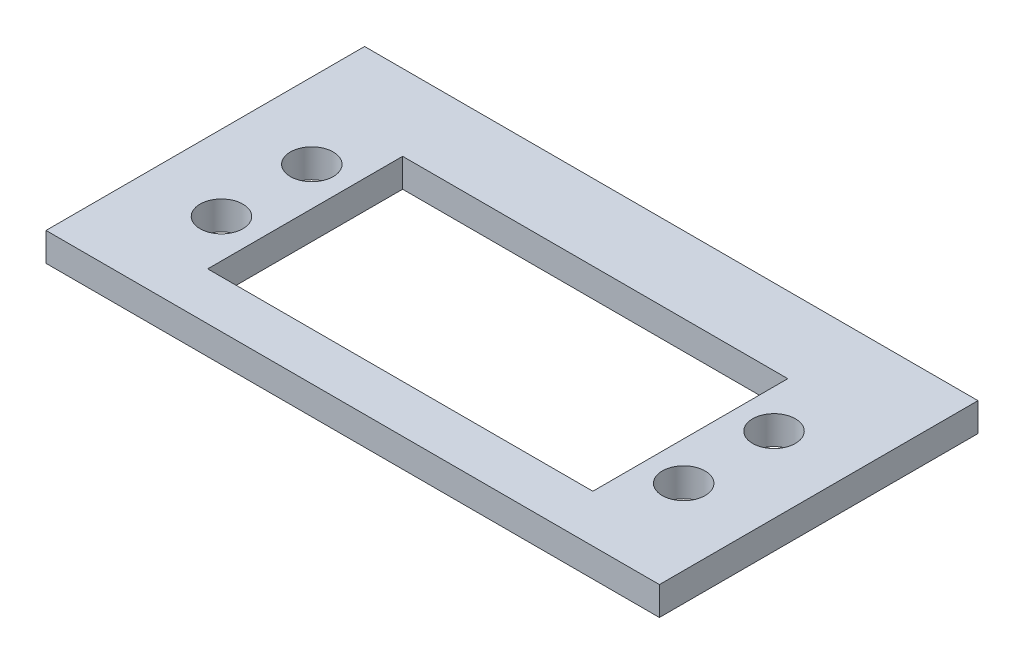
ISO-10303-21;
HEADER;
FILE_DESCRIPTION(('STEP AP214'),'2;1');
FILE_NAME('part.step','',(''),(''),'','','');
FILE_SCHEMA(('AUTOMOTIVE_DESIGN { 1 0 10303 214 1 1 1 1 }'));
ENDSEC;
DATA;
#1=APPLICATION_CONTEXT('core data for automotive mechanical design processes');
#2=APPLICATION_PROTOCOL_DEFINITION('international standard','automotive_design',2000,#1);
#3=PRODUCT_CONTEXT('',#1,'mechanical');
#4=PRODUCT('Part','Part','',(#3));
#5=PRODUCT_RELATED_PRODUCT_CATEGORY('part','',(#4));
#6=PRODUCT_DEFINITION_FORMATION('','',#4);
#7=PRODUCT_DEFINITION_CONTEXT('part definition',#1,'design');
#8=PRODUCT_DEFINITION('design','',#6,#7);
#9=PRODUCT_DEFINITION_SHAPE('','',#8);
#10=(LENGTH_UNIT() NAMED_UNIT(*) SI_UNIT(.MILLI.,.METRE.));
#11=(NAMED_UNIT(*) PLANE_ANGLE_UNIT() SI_UNIT($,.RADIAN.));
#12=(NAMED_UNIT(*) SI_UNIT($,.STERADIAN.) SOLID_ANGLE_UNIT());
#13=UNCERTAINTY_MEASURE_WITH_UNIT(LENGTH_MEASURE(1.E-05),#10,'distance_accuracy_value','');
#14=(GEOMETRIC_REPRESENTATION_CONTEXT(3) GLOBAL_UNCERTAINTY_ASSIGNED_CONTEXT((#13)) GLOBAL_UNIT_ASSIGNED_CONTEXT((#10,
#11,#12)) REPRESENTATION_CONTEXT('',''));
#15=CARTESIAN_POINT('',(0.,0.,0.));
#16=DIRECTION('',(0.,0.,1.));
#17=DIRECTION('',(1.,0.,0.));
#18=AXIS2_PLACEMENT_3D('',#15,#16,#17);
#19=CARTESIAN_POINT('',(0.,3.,0.));
#20=DIRECTION('',(0.,-1.,0.));
#21=DIRECTION('',(0.,0.,-1.));
#22=AXIS2_PLACEMENT_3D('',#19,#20,#21);
#23=PLANE('',#22);
#24=CARTESIAN_POINT('',(56.55,3.,-20.));
#25=DIRECTION('',(0.,1.,0.));
#26=DIRECTION('',(0.,0.,1.));
#27=AXIS2_PLACEMENT_3D('',#24,#25,#26);
#28=CIRCLE('',#27,2.25);
#29=CARTESIAN_POINT('',(56.55,3.,-17.75));
#30=VERTEX_POINT('',#29);
#31=EDGE_CURVE('E250',#30,#30,#28,.T.);
#32=ORIENTED_EDGE('',*,*,#31,.F.);
#33=EDGE_LOOP('',(#32));
#34=FACE_BOUND('',#33,.T.);
#35=CARTESIAN_POINT('',(7.95,3.,-20.));
#36=DIRECTION('',(0.,1.,0.));
#37=DIRECTION('',(0.,0.,1.));
#38=AXIS2_PLACEMENT_3D('',#35,#36,#37);
#39=CIRCLE('',#38,2.25);
#40=CARTESIAN_POINT('',(7.95,3.,-17.75));
#41=VERTEX_POINT('',#40);
#42=EDGE_CURVE('E131',#41,#41,#39,.T.);
#43=ORIENTED_EDGE('',*,*,#42,.F.);
#44=EDGE_LOOP('',(#43));
#45=FACE_BOUND('',#44,.T.);
#46=DIRECTION('',(0.,0.,1.));
#47=VECTOR('',#46,1.);
#48=CARTESIAN_POINT('',(0.,3.,0.));
#49=LINE('',#48,#47);
#50=CARTESIAN_POINT('',(0.,3.,-33.5));
#51=VERTEX_POINT('',#50);
#52=CARTESIAN_POINT('',(0.,3.,0.));
#53=VERTEX_POINT('',#52);
#54=EDGE_CURVE('E141',#51,#53,#49,.T.);
#55=ORIENTED_EDGE('',*,*,#54,.T.);
#56=DIRECTION('',(1.,0.,0.));
#57=VECTOR('',#56,1.);
#58=CARTESIAN_POINT('',(0.,3.,0.));
#59=LINE('',#58,#57);
#60=CARTESIAN_POINT('',(64.5,3.,0.));
#61=VERTEX_POINT('',#60);
#62=EDGE_CURVE('E144',#53,#61,#59,.T.);
#63=ORIENTED_EDGE('',*,*,#62,.T.);
#64=DIRECTION('',(0.,0.,-1.));
#65=VECTOR('',#64,1.);
#66=CARTESIAN_POINT('',(64.5,3.,0.));
#67=LINE('',#66,#65);
#68=CARTESIAN_POINT('',(64.5,3.,-33.5));
#69=VERTEX_POINT('',#68);
#70=EDGE_CURVE('E147',#61,#69,#67,.T.);
#71=ORIENTED_EDGE('',*,*,#70,.T.);
#72=DIRECTION('',(-1.,0.,0.));
#73=VECTOR('',#72,1.);
#74=CARTESIAN_POINT('',(0.,3.,-33.5));
#75=LINE('',#74,#73);
#76=EDGE_CURVE('E149',#69,#51,#75,.T.);
#77=ORIENTED_EDGE('',*,*,#76,.T.);
#78=EDGE_LOOP('',(#55,#63,#71,#77));
#79=FACE_BOUND('',#78,.T.);
#80=DIRECTION('',(0.,0.,1.));
#81=VECTOR('',#80,1.);
#82=CARTESIAN_POINT('',(12.,3.,-4.99999999999999));
#83=LINE('',#82,#81);
#84=CARTESIAN_POINT('',(12.,3.,-25.5));
#85=VERTEX_POINT('',#84);
#86=CARTESIAN_POINT('',(12.,3.,-4.99999999999999));
#87=VERTEX_POINT('',#86);
#88=EDGE_CURVE('E102',#85,#87,#83,.T.);
#89=ORIENTED_EDGE('',*,*,#88,.F.);
#90=DIRECTION('',(-1.,0.,0.));
#91=VECTOR('',#90,1.);
#92=CARTESIAN_POINT('',(12.,3.,-25.5));
#93=LINE('',#92,#91);
#94=CARTESIAN_POINT('',(52.5,3.,-25.5));
#95=VERTEX_POINT('',#94);
#96=EDGE_CURVE('E125',#95,#85,#93,.T.);
#97=ORIENTED_EDGE('',*,*,#96,.F.);
#98=DIRECTION('',(0.,0.,-1.));
#99=VECTOR('',#98,1.);
#100=CARTESIAN_POINT('',(52.5,3.,-4.99999999999999));
#101=LINE('',#100,#99);
#102=CARTESIAN_POINT('',(52.5,3.,-4.99999999999999));
#103=VERTEX_POINT('',#102);
#104=EDGE_CURVE('E123',#103,#95,#101,.T.);
#105=ORIENTED_EDGE('',*,*,#104,.F.);
#106=DIRECTION('',(1.,0.,0.));
#107=VECTOR('',#106,1.);
#108=CARTESIAN_POINT('',(12.,3.,-4.99999999999999));
#109=LINE('',#108,#107);
#110=EDGE_CURVE('E110',#87,#103,#109,.T.);
#111=ORIENTED_EDGE('',*,*,#110,.F.);
#112=EDGE_LOOP('',(#89,#97,#105,#111));
#113=FACE_BOUND('',#112,.T.);
#114=CARTESIAN_POINT('',(7.95,3.,-10.5));
#115=DIRECTION('',(0.,1.,0.));
#116=DIRECTION('',(0.,0.,1.));
#117=AXIS2_PLACEMENT_3D('',#114,#115,#116);
#118=CIRCLE('',#117,2.25);
#119=CARTESIAN_POINT('',(7.95,3.,-8.25));
#120=VERTEX_POINT('',#119);
#121=EDGE_CURVE('E256',#120,#120,#118,.T.);
#122=ORIENTED_EDGE('',*,*,#121,.F.);
#123=EDGE_LOOP('',(#122));
#124=FACE_BOUND('',#123,.T.);
#125=CARTESIAN_POINT('',(56.55,3.,-10.5));
#126=DIRECTION('',(0.,1.,0.));
#127=DIRECTION('',(0.,0.,1.));
#128=AXIS2_PLACEMENT_3D('',#125,#126,#127);
#129=CIRCLE('',#128,2.25);
#130=CARTESIAN_POINT('',(56.55,3.,-8.24999999999999));
#131=VERTEX_POINT('',#130);
#132=EDGE_CURVE('E241',#131,#131,#129,.T.);
#133=ORIENTED_EDGE('',*,*,#132,.F.);
#134=EDGE_LOOP('',(#133));
#135=FACE_BOUND('',#134,.T.);
#136=ADVANCED_FACE('F37',(#34,#45,#79,#113,#124,#135),#23,.F.);
#137=CARTESIAN_POINT('',(0.,0.,0.));
#138=DIRECTION('',(0.,-1.,0.));
#139=DIRECTION('',(0.,0.,-1.));
#140=AXIS2_PLACEMENT_3D('',#137,#138,#139);
#141=PLANE('',#140);
#142=CARTESIAN_POINT('',(56.55,0.,-20.));
#143=DIRECTION('',(0.,1.,0.));
#144=DIRECTION('',(0.,0.,1.));
#145=AXIS2_PLACEMENT_3D('',#142,#143,#144);
#146=CIRCLE('',#145,2.25);
#147=CARTESIAN_POINT('',(56.55,0.,-17.75));
#148=VERTEX_POINT('',#147);
#149=EDGE_CURVE('E247',#148,#148,#146,.T.);
#150=ORIENTED_EDGE('',*,*,#149,.T.);
#151=EDGE_LOOP('',(#150));
#152=FACE_BOUND('',#151,.T.);
#153=CARTESIAN_POINT('',(7.95,0.,-20.));
#154=DIRECTION('',(0.,1.,0.));
#155=DIRECTION('',(0.,0.,1.));
#156=AXIS2_PLACEMENT_3D('',#153,#154,#155);
#157=CIRCLE('',#156,2.25);
#158=CARTESIAN_POINT('',(7.95,0.,-17.75));
#159=VERTEX_POINT('',#158);
#160=EDGE_CURVE('E259',#159,#159,#157,.T.);
#161=ORIENTED_EDGE('',*,*,#160,.T.);
#162=EDGE_LOOP('',(#161));
#163=FACE_BOUND('',#162,.T.);
#164=DIRECTION('',(0.,0.,1.));
#165=VECTOR('',#164,1.);
#166=CARTESIAN_POINT('',(0.,0.,0.));
#167=LINE('',#166,#165);
#168=CARTESIAN_POINT('',(0.,0.,-33.5));
#169=VERTEX_POINT('',#168);
#170=CARTESIAN_POINT('',(0.,0.,0.));
#171=VERTEX_POINT('',#170);
#172=EDGE_CURVE('E118',#169,#171,#167,.T.);
#173=ORIENTED_EDGE('',*,*,#172,.F.);
#174=DIRECTION('',(-1.,0.,0.));
#175=VECTOR('',#174,1.);
#176=CARTESIAN_POINT('',(0.,0.,-33.5));
#177=LINE('',#176,#175);
#178=CARTESIAN_POINT('',(64.5,0.,-33.5));
#179=VERTEX_POINT('',#178);
#180=EDGE_CURVE('E145',#179,#169,#177,.T.);
#181=ORIENTED_EDGE('',*,*,#180,.F.);
#182=DIRECTION('',(0.,0.,-1.));
#183=VECTOR('',#182,1.);
#184=CARTESIAN_POINT('',(64.5,0.,0.));
#185=LINE('',#184,#183);
#186=CARTESIAN_POINT('',(64.5,0.,0.));
#187=VERTEX_POINT('',#186);
#188=EDGE_CURVE('E156',#187,#179,#185,.T.);
#189=ORIENTED_EDGE('',*,*,#188,.F.);
#190=DIRECTION('',(1.,0.,0.));
#191=VECTOR('',#190,1.);
#192=CARTESIAN_POINT('',(0.,0.,0.));
#193=LINE('',#192,#191);
#194=EDGE_CURVE('E154',#171,#187,#193,.T.);
#195=ORIENTED_EDGE('',*,*,#194,.F.);
#196=EDGE_LOOP('',(#173,#181,#189,#195));
#197=FACE_BOUND('',#196,.T.);
#198=DIRECTION('',(-1.,0.,0.));
#199=VECTOR('',#198,1.);
#200=CARTESIAN_POINT('',(12.,0.,-25.5));
#201=LINE('',#200,#199);
#202=CARTESIAN_POINT('',(52.5,0.,-25.5));
#203=VERTEX_POINT('',#202);
#204=CARTESIAN_POINT('',(12.,0.,-25.5));
#205=VERTEX_POINT('',#204);
#206=EDGE_CURVE('E111',#203,#205,#201,.T.);
#207=ORIENTED_EDGE('',*,*,#206,.T.);
#208=DIRECTION('',(0.,0.,1.));
#209=VECTOR('',#208,1.);
#210=CARTESIAN_POINT('',(12.,0.,-4.99999999999999));
#211=LINE('',#210,#209);
#212=CARTESIAN_POINT('',(12.,0.,-4.99999999999999));
#213=VERTEX_POINT('',#212);
#214=EDGE_CURVE('E60',#205,#213,#211,.T.);
#215=ORIENTED_EDGE('',*,*,#214,.T.);
#216=DIRECTION('',(1.,0.,0.));
#217=VECTOR('',#216,1.);
#218=CARTESIAN_POINT('',(12.,0.,-4.99999999999999));
#219=LINE('',#218,#217);
#220=CARTESIAN_POINT('',(52.5,0.,-4.99999999999999));
#221=VERTEX_POINT('',#220);
#222=EDGE_CURVE('E117',#213,#221,#219,.T.);
#223=ORIENTED_EDGE('',*,*,#222,.T.);
#224=DIRECTION('',(0.,0.,-1.));
#225=VECTOR('',#224,1.);
#226=CARTESIAN_POINT('',(52.5,0.,-4.99999999999999));
#227=LINE('',#226,#225);
#228=EDGE_CURVE('E133',#221,#203,#227,.T.);
#229=ORIENTED_EDGE('',*,*,#228,.T.);
#230=EDGE_LOOP('',(#207,#215,#223,#229));
#231=FACE_BOUND('',#230,.T.);
#232=CARTESIAN_POINT('',(7.95,0.,-10.5));
#233=DIRECTION('',(0.,1.,0.));
#234=DIRECTION('',(0.,0.,1.));
#235=AXIS2_PLACEMENT_3D('',#232,#233,#234);
#236=CIRCLE('',#235,2.25);
#237=CARTESIAN_POINT('',(7.95,0.,-8.25));
#238=VERTEX_POINT('',#237);
#239=EDGE_CURVE('E253',#238,#238,#236,.T.);
#240=ORIENTED_EDGE('',*,*,#239,.T.);
#241=EDGE_LOOP('',(#240));
#242=FACE_BOUND('',#241,.T.);
#243=CARTESIAN_POINT('',(56.55,0.,-10.5));
#244=DIRECTION('',(0.,1.,0.));
#245=DIRECTION('',(0.,0.,1.));
#246=AXIS2_PLACEMENT_3D('',#243,#244,#245);
#247=CIRCLE('',#246,2.25);
#248=CARTESIAN_POINT('',(56.55,0.,-8.24999999999999));
#249=VERTEX_POINT('',#248);
#250=EDGE_CURVE('E244',#249,#249,#247,.T.);
#251=ORIENTED_EDGE('',*,*,#250,.T.);
#252=EDGE_LOOP('',(#251));
#253=FACE_BOUND('',#252,.T.);
#254=ADVANCED_FACE('F174',(#152,#163,#197,#231,#242,#253),#141,.T.);
#255=CARTESIAN_POINT('',(0.,3.,0.));
#256=DIRECTION('',(1.,0.,0.));
#257=DIRECTION('',(0.,0.,-1.));
#258=AXIS2_PLACEMENT_3D('',#255,#256,#257);
#259=PLANE('',#258);
#260=ORIENTED_EDGE('',*,*,#172,.T.);
#261=DIRECTION('',(0.,-1.,0.));
#262=VECTOR('',#261,1.);
#263=CARTESIAN_POINT('',(0.,3.,0.));
#264=LINE('',#263,#262);
#265=EDGE_CURVE('E11',#53,#171,#264,.T.);
#266=ORIENTED_EDGE('',*,*,#265,.F.);
#267=ORIENTED_EDGE('',*,*,#54,.F.);
#268=DIRECTION('',(0.,-1.,0.));
#269=VECTOR('',#268,1.);
#270=CARTESIAN_POINT('',(0.,3.,-33.5));
#271=LINE('',#270,#269);
#272=EDGE_CURVE('E151',#51,#169,#271,.T.);
#273=ORIENTED_EDGE('',*,*,#272,.T.);
#274=EDGE_LOOP('',(#260,#266,#267,#273));
#275=FACE_BOUND('',#274,.T.);
#276=ADVANCED_FACE('F39',(#275),#259,.F.);
#277=CARTESIAN_POINT('',(0.,3.,0.));
#278=DIRECTION('',(0.,0.,-1.));
#279=DIRECTION('',(-1.,0.,0.));
#280=AXIS2_PLACEMENT_3D('',#277,#278,#279);
#281=PLANE('',#280);
#282=ORIENTED_EDGE('',*,*,#194,.T.);
#283=DIRECTION('',(0.,-1.,0.));
#284=VECTOR('',#283,1.);
#285=CARTESIAN_POINT('',(64.5,3.,0.));
#286=LINE('',#285,#284);
#287=EDGE_CURVE('E45',#61,#187,#286,.T.);
#288=ORIENTED_EDGE('',*,*,#287,.F.);
#289=ORIENTED_EDGE('',*,*,#62,.F.);
#290=ORIENTED_EDGE('',*,*,#265,.T.);
#291=EDGE_LOOP('',(#282,#288,#289,#290));
#292=FACE_BOUND('',#291,.T.);
#293=ADVANCED_FACE('F184',(#292),#281,.F.);
#294=CARTESIAN_POINT('',(64.5,3.,0.));
#295=DIRECTION('',(-1.,0.,0.));
#296=DIRECTION('',(0.,0.,1.));
#297=AXIS2_PLACEMENT_3D('',#294,#295,#296);
#298=PLANE('',#297);
#299=ORIENTED_EDGE('',*,*,#188,.T.);
#300=DIRECTION('',(0.,-1.,0.));
#301=VECTOR('',#300,1.);
#302=CARTESIAN_POINT('',(64.5,3.,-33.5));
#303=LINE('',#302,#301);
#304=EDGE_CURVE('E161',#69,#179,#303,.T.);
#305=ORIENTED_EDGE('',*,*,#304,.F.);
#306=ORIENTED_EDGE('',*,*,#70,.F.);
#307=ORIENTED_EDGE('',*,*,#287,.T.);
#308=EDGE_LOOP('',(#299,#305,#306,#307));
#309=FACE_BOUND('',#308,.T.);
#310=ADVANCED_FACE('F168',(#309),#298,.F.);
#311=CARTESIAN_POINT('',(0.,3.,-33.5));
#312=DIRECTION('',(0.,0.,1.));
#313=DIRECTION('',(1.,0.,0.));
#314=AXIS2_PLACEMENT_3D('',#311,#312,#313);
#315=PLANE('',#314);
#316=ORIENTED_EDGE('',*,*,#180,.T.);
#317=ORIENTED_EDGE('',*,*,#272,.F.);
#318=ORIENTED_EDGE('',*,*,#76,.F.);
#319=ORIENTED_EDGE('',*,*,#304,.T.);
#320=EDGE_LOOP('',(#316,#317,#318,#319));
#321=FACE_BOUND('',#320,.T.);
#322=ADVANCED_FACE('F178',(#321),#315,.F.);
#323=CARTESIAN_POINT('',(12.,3.,-4.99999999999999));
#324=DIRECTION('',(1.,0.,0.));
#325=DIRECTION('',(0.,0.,-1.));
#326=AXIS2_PLACEMENT_3D('',#323,#324,#325);
#327=PLANE('',#326);
#328=ORIENTED_EDGE('',*,*,#214,.F.);
#329=DIRECTION('',(0.,-1.,0.));
#330=VECTOR('',#329,1.);
#331=CARTESIAN_POINT('',(12.,3.,-25.5));
#332=LINE('',#331,#330);
#333=EDGE_CURVE('E106',#85,#205,#332,.T.);
#334=ORIENTED_EDGE('',*,*,#333,.F.);
#335=ORIENTED_EDGE('',*,*,#88,.T.);
#336=DIRECTION('',(0.,-1.,0.));
#337=VECTOR('',#336,1.);
#338=CARTESIAN_POINT('',(12.,3.,-4.99999999999999));
#339=LINE('',#338,#337);
#340=EDGE_CURVE('E105',#87,#213,#339,.T.);
#341=ORIENTED_EDGE('',*,*,#340,.T.);
#342=EDGE_LOOP('',(#328,#334,#335,#341));
#343=FACE_BOUND('',#342,.T.);
#344=ADVANCED_FACE('F104',(#343),#327,.T.);
#345=CARTESIAN_POINT('',(12.,3.,-4.99999999999999));
#346=DIRECTION('',(0.,0.,-1.));
#347=DIRECTION('',(-1.,0.,0.));
#348=AXIS2_PLACEMENT_3D('',#345,#346,#347);
#349=PLANE('',#348);
#350=ORIENTED_EDGE('',*,*,#222,.F.);
#351=ORIENTED_EDGE('',*,*,#340,.F.);
#352=ORIENTED_EDGE('',*,*,#110,.T.);
#353=DIRECTION('',(0.,-1.,0.));
#354=VECTOR('',#353,1.);
#355=CARTESIAN_POINT('',(52.5,3.,-4.99999999999999));
#356=LINE('',#355,#354);
#357=EDGE_CURVE('E119',#103,#221,#356,.T.);
#358=ORIENTED_EDGE('',*,*,#357,.T.);
#359=EDGE_LOOP('',(#350,#351,#352,#358));
#360=FACE_BOUND('',#359,.T.);
#361=ADVANCED_FACE('F114',(#360),#349,.T.);
#362=CARTESIAN_POINT('',(52.5,3.,-4.99999999999999));
#363=DIRECTION('',(-1.,0.,0.));
#364=DIRECTION('',(0.,0.,1.));
#365=AXIS2_PLACEMENT_3D('',#362,#363,#364);
#366=PLANE('',#365);
#367=ORIENTED_EDGE('',*,*,#228,.F.);
#368=ORIENTED_EDGE('',*,*,#357,.F.);
#369=ORIENTED_EDGE('',*,*,#104,.T.);
#370=DIRECTION('',(0.,-1.,0.));
#371=VECTOR('',#370,1.);
#372=CARTESIAN_POINT('',(52.5,3.,-25.5));
#373=LINE('',#372,#371);
#374=EDGE_CURVE('E52',#95,#203,#373,.T.);
#375=ORIENTED_EDGE('',*,*,#374,.T.);
#376=EDGE_LOOP('',(#367,#368,#369,#375));
#377=FACE_BOUND('',#376,.T.);
#378=ADVANCED_FACE('F211',(#377),#366,.T.);
#379=CARTESIAN_POINT('',(12.,3.,-25.5));
#380=DIRECTION('',(0.,0.,1.));
#381=DIRECTION('',(1.,0.,0.));
#382=AXIS2_PLACEMENT_3D('',#379,#380,#381);
#383=PLANE('',#382);
#384=ORIENTED_EDGE('',*,*,#206,.F.);
#385=ORIENTED_EDGE('',*,*,#374,.F.);
#386=ORIENTED_EDGE('',*,*,#96,.T.);
#387=ORIENTED_EDGE('',*,*,#333,.T.);
#388=EDGE_LOOP('',(#384,#385,#386,#387));
#389=FACE_BOUND('',#388,.T.);
#390=ADVANCED_FACE('F215',(#389),#383,.T.);
#391=CARTESIAN_POINT('',(7.95,3.,-20.));
#392=DIRECTION('',(0.,-1.,0.));
#393=DIRECTION('',(0.,0.,-1.));
#394=AXIS2_PLACEMENT_3D('',#391,#392,#393);
#395=CYLINDRICAL_SURFACE('',#394,2.25);
#396=ORIENTED_EDGE('',*,*,#42,.T.);
#397=EDGE_LOOP('',(#396));
#398=FACE_BOUND('',#397,.T.);
#399=ORIENTED_EDGE('',*,*,#160,.F.);
#400=EDGE_LOOP('',(#399));
#401=FACE_BOUND('',#400,.T.);
#402=ADVANCED_FACE('F221',(#398,#401),#395,.F.);
#403=CARTESIAN_POINT('',(7.95,3.,-10.5));
#404=DIRECTION('',(0.,-1.,0.));
#405=DIRECTION('',(0.,0.,-1.));
#406=AXIS2_PLACEMENT_3D('',#403,#404,#405);
#407=CYLINDRICAL_SURFACE('',#406,2.25);
#408=ORIENTED_EDGE('',*,*,#121,.T.);
#409=EDGE_LOOP('',(#408));
#410=FACE_BOUND('',#409,.T.);
#411=ORIENTED_EDGE('',*,*,#239,.F.);
#412=EDGE_LOOP('',(#411));
#413=FACE_BOUND('',#412,.T.);
#414=ADVANCED_FACE('F224',(#410,#413),#407,.F.);
#415=CARTESIAN_POINT('',(56.55,3.,-20.));
#416=DIRECTION('',(0.,-1.,0.));
#417=DIRECTION('',(0.,0.,-1.));
#418=AXIS2_PLACEMENT_3D('',#415,#416,#417);
#419=CYLINDRICAL_SURFACE('',#418,2.25);
#420=ORIENTED_EDGE('',*,*,#31,.T.);
#421=EDGE_LOOP('',(#420));
#422=FACE_BOUND('',#421,.T.);
#423=ORIENTED_EDGE('',*,*,#149,.F.);
#424=EDGE_LOOP('',(#423));
#425=FACE_BOUND('',#424,.T.);
#426=ADVANCED_FACE('F228',(#422,#425),#419,.F.);
#427=CARTESIAN_POINT('',(56.55,3.,-10.5));
#428=DIRECTION('',(0.,-1.,0.));
#429=DIRECTION('',(0.,0.,-1.));
#430=AXIS2_PLACEMENT_3D('',#427,#428,#429);
#431=CYLINDRICAL_SURFACE('',#430,2.25);
#432=ORIENTED_EDGE('',*,*,#132,.T.);
#433=EDGE_LOOP('',(#432));
#434=FACE_BOUND('',#433,.T.);
#435=ORIENTED_EDGE('',*,*,#250,.F.);
#436=EDGE_LOOP('',(#435));
#437=FACE_BOUND('',#436,.T.);
#438=ADVANCED_FACE('F232',(#434,#437),#431,.F.);
#439=CLOSED_SHELL('',(#136,#254,#276,#293,#310,#322,#344,#361,#378,#390,#402,#414,#426,#438));
#440=MANIFOLD_SOLID_BREP('B2',#439);
#441=ADVANCED_BREP_SHAPE_REPRESENTATION('',(#18,#440),#14);
#442=SHAPE_DEFINITION_REPRESENTATION(#9,#441);
ENDSEC;
END-ISO-10303-21;
